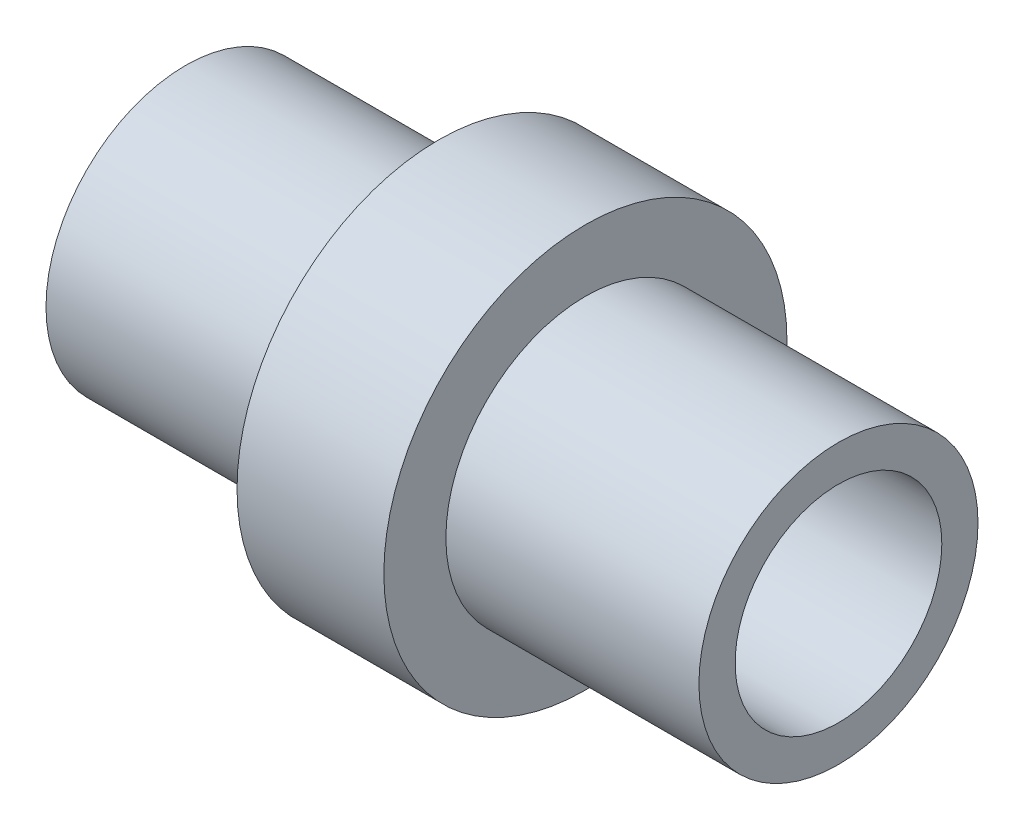
ISO-10303-21;
HEADER;
FILE_DESCRIPTION(('STEP AP214'),'2;1');
FILE_NAME('part.step','',(''),(''),'','','');
FILE_SCHEMA(('AUTOMOTIVE_DESIGN { 1 0 10303 214 1 1 1 1 }'));
ENDSEC;
DATA;
#1=APPLICATION_CONTEXT('core data for automotive mechanical design processes');
#2=APPLICATION_PROTOCOL_DEFINITION('international standard','automotive_design',2000,#1);
#3=PRODUCT_CONTEXT('',#1,'mechanical');
#4=PRODUCT('Part','Part','',(#3));
#5=PRODUCT_RELATED_PRODUCT_CATEGORY('part','',(#4));
#6=PRODUCT_DEFINITION_FORMATION('','',#4);
#7=PRODUCT_DEFINITION_CONTEXT('part definition',#1,'design');
#8=PRODUCT_DEFINITION('design','',#6,#7);
#9=PRODUCT_DEFINITION_SHAPE('','',#8);
#10=(LENGTH_UNIT() NAMED_UNIT(*) SI_UNIT(.MILLI.,.METRE.));
#11=(NAMED_UNIT(*) PLANE_ANGLE_UNIT() SI_UNIT($,.RADIAN.));
#12=(NAMED_UNIT(*) SI_UNIT($,.STERADIAN.) SOLID_ANGLE_UNIT());
#13=UNCERTAINTY_MEASURE_WITH_UNIT(LENGTH_MEASURE(1.E-05),#10,'distance_accuracy_value','');
#14=(GEOMETRIC_REPRESENTATION_CONTEXT(3) GLOBAL_UNCERTAINTY_ASSIGNED_CONTEXT((#13)) GLOBAL_UNIT_ASSIGNED_CONTEXT((#10,
#11,#12)) REPRESENTATION_CONTEXT('',''));
#15=CARTESIAN_POINT('',(0.,0.,0.));
#16=DIRECTION('',(0.,0.,1.));
#17=DIRECTION('',(1.,0.,0.));
#18=AXIS2_PLACEMENT_3D('',#15,#16,#17);
#19=CARTESIAN_POINT('',(-20.0557353810406,0.,0.));
#20=DIRECTION('',(-1.,0.,0.));
#21=DIRECTION('',(0.,0.,1.));
#22=AXIS2_PLACEMENT_3D('',#19,#20,#21);
#23=PLANE('',#22);
#24=CARTESIAN_POINT('',(-20.0557353810406,0.,0.));
#25=DIRECTION('',(1.,0.,0.));
#26=DIRECTION('',(0.,0.,-1.));
#27=AXIS2_PLACEMENT_3D('',#24,#25,#26);
#28=CIRCLE('',#27,6.35);
#29=CARTESIAN_POINT('',(-20.0557353810406,0.,-6.35));
#30=VERTEX_POINT('',#29);
#31=EDGE_CURVE('E74',#30,#30,#28,.T.);
#32=ORIENTED_EDGE('',*,*,#31,.T.);
#33=EDGE_LOOP('',(#32));
#34=FACE_BOUND('',#33,.T.);
#35=CARTESIAN_POINT('',(-20.0557353810406,0.,0.));
#36=DIRECTION('',(1.,0.,0.));
#37=DIRECTION('',(0.,0.,-1.));
#38=AXIS2_PLACEMENT_3D('',#35,#36,#37);
#39=CIRCLE('',#38,8.5725);
#40=CARTESIAN_POINT('',(-20.0557353810406,0.,-8.57249999999999));
#41=VERTEX_POINT('',#40);
#42=EDGE_CURVE('E10',#41,#41,#39,.T.);
#43=ORIENTED_EDGE('',*,*,#42,.F.);
#44=EDGE_LOOP('',(#43));
#45=FACE_BOUND('',#44,.T.);
#46=ADVANCED_FACE('F43',(#34,#45),#23,.T.);
#47=CARTESIAN_POINT('',(20.0557353810406,0.,0.));
#48=DIRECTION('',(1.,0.,0.));
#49=DIRECTION('',(0.,0.,-1.));
#50=AXIS2_PLACEMENT_3D('',#47,#48,#49);
#51=CYLINDRICAL_SURFACE('',#50,8.5725);
#52=ORIENTED_EDGE('',*,*,#42,.T.);
#53=EDGE_LOOP('',(#52));
#54=FACE_BOUND('',#53,.T.);
#55=CARTESIAN_POINT('',(-4.51024099596369,0.,0.));
#56=DIRECTION('',(1.,0.,0.));
#57=DIRECTION('',(0.,0.,-1.));
#58=AXIS2_PLACEMENT_3D('',#55,#56,#57);
#59=CIRCLE('',#58,8.57250000000001);
#60=CARTESIAN_POINT('',(-4.51024099596369,0.,-8.5725));
#61=VERTEX_POINT('',#60);
#62=EDGE_CURVE('E51',#61,#61,#59,.T.);
#63=ORIENTED_EDGE('',*,*,#62,.F.);
#64=EDGE_LOOP('',(#63));
#65=FACE_BOUND('',#64,.T.);
#66=ADVANCED_FACE('F104',(#54,#65),#51,.T.);
#67=CARTESIAN_POINT('',(-4.51024099596369,0.,-8.5725));
#68=DIRECTION('',(-1.,0.,0.));
#69=DIRECTION('',(0.,0.,1.));
#70=AXIS2_PLACEMENT_3D('',#67,#68,#69);
#71=PLANE('',#70);
#72=ORIENTED_EDGE('',*,*,#62,.T.);
#73=EDGE_LOOP('',(#72));
#74=FACE_BOUND('',#73,.T.);
#75=CARTESIAN_POINT('',(-4.51024099596368,0.,0.));
#76=DIRECTION('',(1.,0.,0.));
#77=DIRECTION('',(0.,0.,-1.));
#78=AXIS2_PLACEMENT_3D('',#75,#76,#77);
#79=CIRCLE('',#78,12.3825);
#80=CARTESIAN_POINT('',(-4.51024099596368,0.,-12.3825));
#81=VERTEX_POINT('',#80);
#82=EDGE_CURVE('E56',#81,#81,#79,.T.);
#83=ORIENTED_EDGE('',*,*,#82,.F.);
#84=EDGE_LOOP('',(#83));
#85=FACE_BOUND('',#84,.T.);
#86=ADVANCED_FACE('F108',(#74,#85),#71,.T.);
#87=CARTESIAN_POINT('',(20.0557353810406,0.,0.));
#88=DIRECTION('',(1.,0.,0.));
#89=DIRECTION('',(0.,0.,-1.));
#90=AXIS2_PLACEMENT_3D('',#87,#88,#89);
#91=CYLINDRICAL_SURFACE('',#90,12.3825);
#92=ORIENTED_EDGE('',*,*,#82,.T.);
#93=EDGE_LOOP('',(#92));
#94=FACE_BOUND('',#93,.T.);
#95=CARTESIAN_POINT('',(4.51024099596369,0.,0.));
#96=DIRECTION('',(1.,0.,0.));
#97=DIRECTION('',(0.,0.,-1.));
#98=AXIS2_PLACEMENT_3D('',#95,#96,#97);
#99=CIRCLE('',#98,12.3825);
#100=CARTESIAN_POINT('',(4.51024099596368,0.,-12.3825));
#101=VERTEX_POINT('',#100);
#102=EDGE_CURVE('E62',#101,#101,#99,.T.);
#103=ORIENTED_EDGE('',*,*,#102,.F.);
#104=EDGE_LOOP('',(#103));
#105=FACE_BOUND('',#104,.T.);
#106=ADVANCED_FACE('F101',(#94,#105),#91,.T.);
#107=CARTESIAN_POINT('',(4.51024099596369,0.,-12.3825));
#108=DIRECTION('',(1.,0.,0.));
#109=DIRECTION('',(0.,0.,-1.));
#110=AXIS2_PLACEMENT_3D('',#107,#108,#109);
#111=PLANE('',#110);
#112=ORIENTED_EDGE('',*,*,#102,.T.);
#113=EDGE_LOOP('',(#112));
#114=FACE_BOUND('',#113,.T.);
#115=CARTESIAN_POINT('',(4.51024099596369,0.,0.));
#116=DIRECTION('',(1.,0.,0.));
#117=DIRECTION('',(0.,0.,-1.));
#118=AXIS2_PLACEMENT_3D('',#115,#116,#117);
#119=CIRCLE('',#118,8.5725);
#120=CARTESIAN_POINT('',(4.51024099596369,0.,-8.5725));
#121=VERTEX_POINT('',#120);
#122=EDGE_CURVE('E66',#121,#121,#119,.T.);
#123=ORIENTED_EDGE('',*,*,#122,.F.);
#124=EDGE_LOOP('',(#123));
#125=FACE_BOUND('',#124,.T.);
#126=ADVANCED_FACE('F94',(#114,#125),#111,.T.);
#127=CARTESIAN_POINT('',(20.0557353810406,0.,0.));
#128=DIRECTION('',(1.,0.,0.));
#129=DIRECTION('',(0.,0.,-1.));
#130=AXIS2_PLACEMENT_3D('',#127,#128,#129);
#131=CYLINDRICAL_SURFACE('',#130,8.5725);
#132=ORIENTED_EDGE('',*,*,#122,.T.);
#133=EDGE_LOOP('',(#132));
#134=FACE_BOUND('',#133,.T.);
#135=CARTESIAN_POINT('',(20.0557353810406,0.,0.));
#136=DIRECTION('',(1.,0.,0.));
#137=DIRECTION('',(0.,0.,-1.));
#138=AXIS2_PLACEMENT_3D('',#135,#136,#137);
#139=CIRCLE('',#138,8.5725);
#140=CARTESIAN_POINT('',(20.0557353810406,0.,-8.5725));
#141=VERTEX_POINT('',#140);
#142=EDGE_CURVE('E70',#141,#141,#139,.T.);
#143=ORIENTED_EDGE('',*,*,#142,.F.);
#144=EDGE_LOOP('',(#143));
#145=FACE_BOUND('',#144,.T.);
#146=ADVANCED_FACE('F89',(#134,#145),#131,.T.);
#147=CARTESIAN_POINT('',(20.0557353810406,0.,-8.5725));
#148=DIRECTION('',(1.,0.,0.));
#149=DIRECTION('',(0.,0.,-1.));
#150=AXIS2_PLACEMENT_3D('',#147,#148,#149);
#151=PLANE('',#150);
#152=CARTESIAN_POINT('',(20.0557353810406,0.,0.));
#153=DIRECTION('',(1.,0.,0.));
#154=DIRECTION('',(0.,0.,-1.));
#155=AXIS2_PLACEMENT_3D('',#152,#153,#154);
#156=CIRCLE('',#155,6.35);
#157=CARTESIAN_POINT('',(20.0557353810406,0.,-6.35));
#158=VERTEX_POINT('',#157);
#159=EDGE_CURVE('E46',#158,#158,#156,.T.);
#160=ORIENTED_EDGE('',*,*,#159,.F.);
#161=EDGE_LOOP('',(#160));
#162=FACE_BOUND('',#161,.T.);
#163=ORIENTED_EDGE('',*,*,#142,.T.);
#164=EDGE_LOOP('',(#163));
#165=FACE_BOUND('',#164,.T.);
#166=ADVANCED_FACE('F86',(#162,#165),#151,.T.);
#167=CARTESIAN_POINT('',(-20.0557353810406,0.,0.));
#168=DIRECTION('',(1.,0.,0.));
#169=DIRECTION('',(0.,0.,-1.));
#170=AXIS2_PLACEMENT_3D('',#167,#168,#169);
#171=CYLINDRICAL_SURFACE('',#170,6.35);
#172=ORIENTED_EDGE('',*,*,#159,.T.);
#173=EDGE_LOOP('',(#172));
#174=FACE_BOUND('',#173,.T.);
#175=ORIENTED_EDGE('',*,*,#31,.F.);
#176=EDGE_LOOP('',(#175));
#177=FACE_BOUND('',#176,.T.);
#178=ADVANCED_FACE('F83',(#174,#177),#171,.F.);
#179=CLOSED_SHELL('',(#46,#66,#86,#106,#126,#146,#166,#178));
#180=MANIFOLD_SOLID_BREP('B2',#179);
#181=ADVANCED_BREP_SHAPE_REPRESENTATION('',(#18,#180),#14);
#182=SHAPE_DEFINITION_REPRESENTATION(#9,#181);
ENDSEC;
END-ISO-10303-21;
